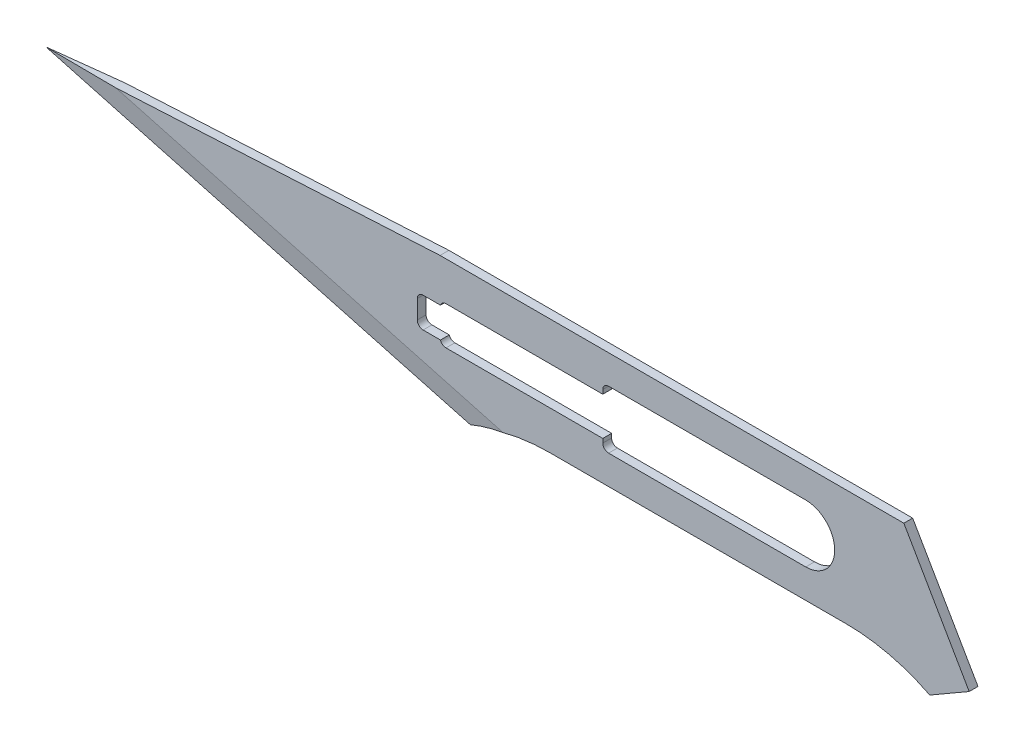
ISO-10303-21;
HEADER;
FILE_DESCRIPTION(('STEP AP214'),'2;1');
FILE_NAME('part.step','',(''),(''),'','','');
FILE_SCHEMA(('AUTOMOTIVE_DESIGN { 1 0 10303 214 1 1 1 1 }'));
ENDSEC;
DATA;
#1=APPLICATION_CONTEXT('core data for automotive mechanical design processes');
#2=APPLICATION_PROTOCOL_DEFINITION('international standard','automotive_design',2000,#1);
#3=PRODUCT_CONTEXT('',#1,'mechanical');
#4=PRODUCT('Part','Part','',(#3));
#5=PRODUCT_RELATED_PRODUCT_CATEGORY('part','',(#4));
#6=PRODUCT_DEFINITION_FORMATION('','',#4);
#7=PRODUCT_DEFINITION_CONTEXT('part definition',#1,'design');
#8=PRODUCT_DEFINITION('design','',#6,#7);
#9=PRODUCT_DEFINITION_SHAPE('','',#8);
#10=(LENGTH_UNIT() NAMED_UNIT(*) SI_UNIT(.MILLI.,.METRE.));
#11=(NAMED_UNIT(*) PLANE_ANGLE_UNIT() SI_UNIT($,.RADIAN.));
#12=(NAMED_UNIT(*) SI_UNIT($,.STERADIAN.) SOLID_ANGLE_UNIT());
#13=UNCERTAINTY_MEASURE_WITH_UNIT(LENGTH_MEASURE(1.E-05),#10,'distance_accuracy_value','');
#14=(GEOMETRIC_REPRESENTATION_CONTEXT(3) GLOBAL_UNCERTAINTY_ASSIGNED_CONTEXT((#13)) GLOBAL_UNIT_ASSIGNED_CONTEXT((#10,
#11,#12)) REPRESENTATION_CONTEXT('',''));
#15=CARTESIAN_POINT('',(0.,0.,0.));
#16=DIRECTION('',(0.,0.,1.));
#17=DIRECTION('',(1.,0.,0.));
#18=AXIS2_PLACEMENT_3D('',#15,#16,#17);
#19=CARTESIAN_POINT('',(4.72498504829211,-13.,0.19));
#20=DIRECTION('',(0.,0.,-1.));
#21=DIRECTION('',(-1.,0.,0.));
#22=AXIS2_PLACEMENT_3D('',#19,#20,#21);
#23=CYLINDRICAL_SURFACE('',#22,8.);
#24=CARTESIAN_POINT('',(4.72498504829211,-13.,-1.13003580173557));
#25=DIRECTION('',(0.0488253910720082,0.180161810286825,-0.982424451701422));
#26=DIRECTION('',(-0.256975742484254,-0.948220054141182,-0.18666064582327));
#27=AXIS2_PLACEMENT_3D('',#24,#25,#26);
#28=ELLIPSE('',#27,8.14311979526275,8.);
#29=CARTESIAN_POINT('',(2.71408046608704,-5.25685704889374,0.19));
#30=VERTEX_POINT('',#29);
#31=CARTESIAN_POINT('',(1.11660591078453,-5.86,0.));
#32=VERTEX_POINT('',#31);
#33=EDGE_CURVE('E215',#30,#32,#28,.F.);
#34=ORIENTED_EDGE('',*,*,#33,.T.);
#35=CARTESIAN_POINT('',(4.72498504829211,-13.,1.13003580173557));
#36=DIRECTION('',(0.0488253910720082,0.180161810286825,0.982424451701422));
#37=DIRECTION('',(0.256975742484254,0.948220054141182,-0.18666064582327));
#38=AXIS2_PLACEMENT_3D('',#35,#36,#37);
#39=ELLIPSE('',#38,8.14311979526275,8.);
#40=CARTESIAN_POINT('',(2.71408046608704,-5.25685704889374,-0.19));
#41=VERTEX_POINT('',#40);
#42=EDGE_CURVE('E202',#32,#41,#39,.F.);
#43=ORIENTED_EDGE('',*,*,#42,.T.);
#44=CARTESIAN_POINT('',(4.72498504829211,-13.,-0.19));
#45=DIRECTION('',(0.,0.,-1.));
#46=DIRECTION('',(1.,0.,0.));
#47=AXIS2_PLACEMENT_3D('',#44,#45,#46);
#48=CIRCLE('',#47,8.);
#49=CARTESIAN_POINT('',(4.72498504829211,-5.,-0.19));
#50=VERTEX_POINT('',#49);
#51=EDGE_CURVE('E212',#41,#50,#48,.T.);
#52=ORIENTED_EDGE('',*,*,#51,.T.);
#53=DIRECTION('',(0.,0.,-1.));
#54=VECTOR('',#53,1.);
#55=CARTESIAN_POINT('',(4.72498504829211,-5.,0.19));
#56=LINE('',#55,#54);
#57=CARTESIAN_POINT('',(4.72498504829211,-5.,0.19));
#58=VERTEX_POINT('',#57);
#59=EDGE_CURVE('E258',#58,#50,#56,.T.);
#60=ORIENTED_EDGE('',*,*,#59,.F.);
#61=CARTESIAN_POINT('',(4.72498504829211,-13.,0.19));
#62=DIRECTION('',(0.,0.,-1.));
#63=DIRECTION('',(1.,0.,0.));
#64=AXIS2_PLACEMENT_3D('',#61,#62,#63);
#65=CIRCLE('',#64,8.);
#66=EDGE_CURVE('E242',#30,#58,#65,.T.);
#67=ORIENTED_EDGE('',*,*,#66,.F.);
#68=EDGE_LOOP('',(#34,#43,#52,#60,#67));
#69=FACE_BOUND('',#68,.T.);
#70=ADVANCED_FACE('F34',(#69),#23,.F.);
#71=CARTESIAN_POINT('',(17.5082267732769,-5.,0.19));
#72=DIRECTION('',(0.,1.,0.));
#73=DIRECTION('',(0.,0.,1.));
#74=AXIS2_PLACEMENT_3D('',#71,#72,#73);
#75=PLANE('',#74);
#76=DIRECTION('',(1.,0.,0.));
#77=VECTOR('',#76,1.);
#78=CARTESIAN_POINT('',(17.5082267732769,-5.,-0.19));
#79=LINE('',#78,#77);
#80=CARTESIAN_POINT('',(17.5082267732769,-5.,-0.19));
#81=VERTEX_POINT('',#80);
#82=EDGE_CURVE('E221',#50,#81,#79,.T.);
#83=ORIENTED_EDGE('',*,*,#82,.T.);
#84=DIRECTION('',(0.,0.,-1.));
#85=VECTOR('',#84,1.);
#86=CARTESIAN_POINT('',(17.5082267732769,-5.,0.19));
#87=LINE('',#86,#85);
#88=CARTESIAN_POINT('',(17.5082267732769,-5.,0.19));
#89=VERTEX_POINT('',#88);
#90=EDGE_CURVE('E255',#89,#81,#87,.T.);
#91=ORIENTED_EDGE('',*,*,#90,.F.);
#92=DIRECTION('',(1.,0.,0.));
#93=VECTOR('',#92,1.);
#94=CARTESIAN_POINT('',(17.5082267732769,-5.,0.19));
#95=LINE('',#94,#93);
#96=EDGE_CURVE('E350',#58,#89,#95,.T.);
#97=ORIENTED_EDGE('',*,*,#96,.F.);
#98=ORIENTED_EDGE('',*,*,#59,.T.);
#99=EDGE_LOOP('',(#83,#91,#97,#98));
#100=FACE_BOUND('',#99,.T.);
#101=ADVANCED_FACE('F473',(#100),#75,.F.);
#102=CARTESIAN_POINT('',(17.5082267732769,-13.,0.19));
#103=DIRECTION('',(0.,0.,-1.));
#104=DIRECTION('',(-1.,0.,0.));
#105=AXIS2_PLACEMENT_3D('',#102,#103,#104);
#106=CYLINDRICAL_SURFACE('',#105,8.);
#107=CARTESIAN_POINT('',(17.5082267732769,-13.,-0.19));
#108=DIRECTION('',(0.,0.,-1.));
#109=DIRECTION('',(1.,0.,0.));
#110=AXIS2_PLACEMENT_3D('',#107,#108,#109);
#111=CIRCLE('',#110,8.);
#112=CARTESIAN_POINT('',(21.1166059107845,-5.86,-0.19));
#113=VERTEX_POINT('',#112);
#114=EDGE_CURVE('E224',#81,#113,#111,.T.);
#115=ORIENTED_EDGE('',*,*,#114,.T.);
#116=DIRECTION('',(0.,0.,-1.));
#117=VECTOR('',#116,1.);
#118=CARTESIAN_POINT('',(21.1166059107845,-5.86,0.19));
#119=LINE('',#118,#117);
#120=CARTESIAN_POINT('',(21.1166059107845,-5.86,0.19));
#121=VERTEX_POINT('',#120);
#122=EDGE_CURVE('E252',#121,#113,#119,.T.);
#123=ORIENTED_EDGE('',*,*,#122,.F.);
#124=CARTESIAN_POINT('',(17.5082267732769,-13.,0.19));
#125=DIRECTION('',(0.,0.,-1.));
#126=DIRECTION('',(1.,0.,0.));
#127=AXIS2_PLACEMENT_3D('',#124,#125,#126);
#128=CIRCLE('',#127,8.);
#129=EDGE_CURVE('E352',#89,#121,#128,.T.);
#130=ORIENTED_EDGE('',*,*,#129,.F.);
#131=ORIENTED_EDGE('',*,*,#90,.T.);
#132=EDGE_LOOP('',(#115,#123,#130,#131));
#133=FACE_BOUND('',#132,.T.);
#134=ADVANCED_FACE('F478',(#133),#106,.F.);
#135=CARTESIAN_POINT('',(22.8166059107845,-4.87850454237764,0.19));
#136=DIRECTION('',(-0.499999999999998,0.86602540378444,0.));
#137=DIRECTION('',(-0.86602540378444,-0.499999999999998,0.));
#138=AXIS2_PLACEMENT_3D('',#135,#136,#137);
#139=PLANE('',#138);
#140=DIRECTION('',(0.86602540378444,0.499999999999998,0.));
#141=VECTOR('',#140,1.);
#142=CARTESIAN_POINT('',(22.8166059107845,-4.87850454237764,-0.19));
#143=LINE('',#142,#141);
#144=CARTESIAN_POINT('',(22.8166059107845,-4.87850454237764,-0.19));
#145=VERTEX_POINT('',#144);
#146=EDGE_CURVE('E234',#113,#145,#143,.T.);
#147=ORIENTED_EDGE('',*,*,#146,.T.);
#148=DIRECTION('',(0.,0.,-1.));
#149=VECTOR('',#148,1.);
#150=CARTESIAN_POINT('',(22.8166059107845,-4.87850454237764,0.19));
#151=LINE('',#150,#149);
#152=CARTESIAN_POINT('',(22.8166059107845,-4.87850454237764,0.19));
#153=VERTEX_POINT('',#152);
#154=EDGE_CURVE('E249',#153,#145,#151,.T.);
#155=ORIENTED_EDGE('',*,*,#154,.F.);
#156=DIRECTION('',(0.86602540378444,0.499999999999998,0.));
#157=VECTOR('',#156,1.);
#158=CARTESIAN_POINT('',(22.8166059107845,-4.87850454237764,0.19));
#159=LINE('',#158,#157);
#160=EDGE_CURVE('E354',#121,#153,#159,.T.);
#161=ORIENTED_EDGE('',*,*,#160,.F.);
#162=ORIENTED_EDGE('',*,*,#122,.T.);
#163=EDGE_LOOP('',(#147,#155,#161,#162));
#164=FACE_BOUND('',#163,.T.);
#165=ADVANCED_FACE('F509',(#164),#139,.F.);
#166=CARTESIAN_POINT('',(20.,0.,0.19));
#167=DIRECTION('',(-0.86602540378444,-0.499999999999998,0.));
#168=DIRECTION('',(0.499999999999998,-0.86602540378444,0.));
#169=AXIS2_PLACEMENT_3D('',#166,#167,#168);
#170=PLANE('',#169);
#171=DIRECTION('',(-0.499999999999998,0.86602540378444,0.));
#172=VECTOR('',#171,1.);
#173=CARTESIAN_POINT('',(20.,0.,-0.19));
#174=LINE('',#173,#172);
#175=CARTESIAN_POINT('',(20.,0.,-0.19));
#176=VERTEX_POINT('',#175);
#177=EDGE_CURVE('E236',#145,#176,#174,.T.);
#178=ORIENTED_EDGE('',*,*,#177,.T.);
#179=DIRECTION('',(0.,0.,-1.));
#180=VECTOR('',#179,1.);
#181=CARTESIAN_POINT('',(20.,0.,0.19));
#182=LINE('',#181,#180);
#183=CARTESIAN_POINT('',(20.,0.,0.19));
#184=VERTEX_POINT('',#183);
#185=EDGE_CURVE('E246',#184,#176,#182,.T.);
#186=ORIENTED_EDGE('',*,*,#185,.F.);
#187=DIRECTION('',(-0.499999999999998,0.86602540378444,0.));
#188=VECTOR('',#187,1.);
#189=CARTESIAN_POINT('',(20.,0.,0.19));
#190=LINE('',#189,#188);
#191=EDGE_CURVE('E356',#153,#184,#190,.T.);
#192=ORIENTED_EDGE('',*,*,#191,.F.);
#193=ORIENTED_EDGE('',*,*,#154,.T.);
#194=EDGE_LOOP('',(#178,#186,#192,#193));
#195=FACE_BOUND('',#194,.T.);
#196=ADVANCED_FACE('F505',(#195),#170,.F.);
#197=CARTESIAN_POINT('',(0.,0.,0.19));
#198=DIRECTION('',(0.,-1.,0.));
#199=DIRECTION('',(0.,0.,-1.));
#200=AXIS2_PLACEMENT_3D('',#197,#198,#199);
#201=PLANE('',#200);
#202=DIRECTION('',(-1.,0.,0.));
#203=VECTOR('',#202,1.);
#204=CARTESIAN_POINT('',(0.,0.,-0.19));
#205=LINE('',#204,#203);
#206=CARTESIAN_POINT('',(0.,0.,-0.19));
#207=VERTEX_POINT('',#206);
#208=EDGE_CURVE('E238',#176,#207,#205,.T.);
#209=ORIENTED_EDGE('',*,*,#208,.T.);
#210=DIRECTION('',(0.,0.,-1.));
#211=VECTOR('',#210,1.);
#212=CARTESIAN_POINT('',(0.,0.,0.19));
#213=LINE('',#212,#211);
#214=CARTESIAN_POINT('',(0.,0.,0.19));
#215=VERTEX_POINT('',#214);
#216=EDGE_CURVE('E243',#215,#207,#213,.T.);
#217=ORIENTED_EDGE('',*,*,#216,.F.);
#218=DIRECTION('',(-1.,0.,0.));
#219=VECTOR('',#218,1.);
#220=CARTESIAN_POINT('',(0.,0.,0.19));
#221=LINE('',#220,#219);
#222=EDGE_CURVE('E357',#184,#215,#221,.T.);
#223=ORIENTED_EDGE('',*,*,#222,.F.);
#224=ORIENTED_EDGE('',*,*,#185,.T.);
#225=EDGE_LOOP('',(#209,#217,#223,#224));
#226=FACE_BOUND('',#225,.T.);
#227=ADVANCED_FACE('F502',(#226),#201,.F.);
#228=CARTESIAN_POINT('',(-17.1833940892155,-0.900543524761129,0.19));
#229=DIRECTION('',(0.0523359562429444,-0.998629534754574,0.));
#230=DIRECTION('',(0.998629534754574,0.0523359562429444,0.));
#231=AXIS2_PLACEMENT_3D('',#228,#229,#230);
#232=PLANE('',#231);
#233=DIRECTION('',(-0.998629534754574,-0.0523359562429444,0.));
#234=VECTOR('',#233,1.);
#235=CARTESIAN_POINT('',(-17.1833940892155,-0.900543524761129,-0.19));
#236=LINE('',#235,#234);
#237=CARTESIAN_POINT('',(-13.9798693463588,-0.732653907109727,-0.19));
#238=VERTEX_POINT('',#237);
#239=EDGE_CURVE('E240',#207,#238,#236,.T.);
#240=ORIENTED_EDGE('',*,*,#239,.T.);
#241=DIRECTION('',(-0.996882532508418,-0.0522443997348209,0.0591247754833006));
#242=VECTOR('',#241,1.);
#243=CARTESIAN_POINT('',(-17.1945927758399,-0.901130423057999,0.000664190424430448));
#244=LINE('',#243,#242);
#245=CARTESIAN_POINT('',(-17.1833940892154,-0.900543524761139,0.));
#246=VERTEX_POINT('',#245);
#247=EDGE_CURVE('E49',#238,#246,#244,.T.);
#248=ORIENTED_EDGE('',*,*,#247,.T.);
#249=DIRECTION('',(0.996882532508418,0.0522443997348209,0.0591247754833006));
#250=VECTOR('',#249,1.);
#251=CARTESIAN_POINT('',(-17.1721954025911,-0.899956626464258,0.000664190424430855));
#252=LINE('',#251,#250);
#253=CARTESIAN_POINT('',(-13.9798693463588,-0.73265390710972,0.19));
#254=VERTEX_POINT('',#253);
#255=EDGE_CURVE('E216',#246,#254,#252,.T.);
#256=ORIENTED_EDGE('',*,*,#255,.T.);
#257=DIRECTION('',(-0.998629534754574,-0.0523359562429444,0.));
#258=VECTOR('',#257,1.);
#259=CARTESIAN_POINT('',(-17.1833940892155,-0.900543524761129,0.19));
#260=LINE('',#259,#258);
#261=EDGE_CURVE('E230',#215,#254,#260,.T.);
#262=ORIENTED_EDGE('',*,*,#261,.F.);
#263=ORIENTED_EDGE('',*,*,#216,.T.);
#264=EDGE_LOOP('',(#240,#248,#256,#262,#263));
#265=FACE_BOUND('',#264,.T.);
#266=ADVANCED_FACE('F366',(#265),#232,.F.);
#267=CARTESIAN_POINT('',(17.5082267732769,-13.,0.19));
#268=DIRECTION('',(0.,0.,1.));
#269=DIRECTION('',(1.,0.,0.));
#270=AXIS2_PLACEMENT_3D('',#267,#268,#269);
#271=PLANE('',#270);
#272=DIRECTION('',(-0.965183686642772,0.261573031940733,0.));
#273=VECTOR('',#272,1.);
#274=CARTESIAN_POINT('',(18.4508851188766,-9.52166566828425,0.19));
#275=LINE('',#274,#273);
#276=EDGE_CURVE('E11',#30,#254,#275,.T.);
#277=ORIENTED_EDGE('',*,*,#276,.F.);
#278=ORIENTED_EDGE('',*,*,#66,.T.);
#279=ORIENTED_EDGE('',*,*,#96,.T.);
#280=ORIENTED_EDGE('',*,*,#129,.T.);
#281=ORIENTED_EDGE('',*,*,#160,.T.);
#282=ORIENTED_EDGE('',*,*,#191,.T.);
#283=ORIENTED_EDGE('',*,*,#222,.T.);
#284=ORIENTED_EDGE('',*,*,#261,.T.);
#285=EDGE_LOOP('',(#277,#278,#279,#280,#281,#282,#283,#284));
#286=FACE_BOUND('',#285,.T.);
#287=DIRECTION('',(0.,-1.,0.));
#288=VECTOR('',#287,1.);
#289=CARTESIAN_POINT('',(-0.983394089215472,-1.85,0.19));
#290=LINE('',#289,#288);
#291=CARTESIAN_POINT('',(-0.983394089215472,-2.1,0.19));
#292=VERTEX_POINT('',#291);
#293=CARTESIAN_POINT('',(-0.983394089215472,-2.9,0.19));
#294=VERTEX_POINT('',#293);
#295=EDGE_CURVE('E326',#292,#294,#290,.T.);
#296=ORIENTED_EDGE('',*,*,#295,.F.);
#297=CARTESIAN_POINT('',(-0.733394089215472,-2.1,0.19));
#298=DIRECTION('',(0.,0.,1.));
#299=DIRECTION('',(1.,0.,0.));
#300=AXIS2_PLACEMENT_3D('',#297,#298,#299);
#301=CIRCLE('',#300,0.25);
#302=CARTESIAN_POINT('',(-0.733394089215472,-1.85,0.19));
#303=VERTEX_POINT('',#302);
#304=EDGE_CURVE('E304',#292,#303,#301,.F.);
#305=ORIENTED_EDGE('',*,*,#304,.T.);
#306=DIRECTION('',(-1.,0.,0.));
#307=VECTOR('',#306,1.);
#308=CARTESIAN_POINT('',(-0.983394089215472,-1.85,0.19));
#309=LINE('',#308,#307);
#310=CARTESIAN_POINT('',(0.0166059107845297,-1.85,0.19));
#311=VERTEX_POINT('',#310);
#312=EDGE_CURVE('E321',#311,#303,#309,.T.);
#313=ORIENTED_EDGE('',*,*,#312,.F.);
#314=CARTESIAN_POINT('',(0.255090711138766,-1.925,0.19));
#315=DIRECTION('',(0.,0.,1.));
#316=DIRECTION('',(1.,0.,0.));
#317=AXIS2_PLACEMENT_3D('',#314,#315,#316);
#318=CIRCLE('',#317,0.25);
#319=CARTESIAN_POINT('',(0.255090711138766,-1.675,0.19));
#320=VERTEX_POINT('',#319);
#321=EDGE_CURVE('E296',#311,#320,#318,.F.);
#322=ORIENTED_EDGE('',*,*,#321,.T.);
#323=DIRECTION('',(-1.,0.,0.));
#324=VECTOR('',#323,1.);
#325=CARTESIAN_POINT('',(0.0166059107845297,-1.675,0.19));
#326=LINE('',#325,#324);
#327=CARTESIAN_POINT('',(7.01660591078453,-1.675,0.19));
#328=VERTEX_POINT('',#327);
#329=EDGE_CURVE('E329',#328,#320,#326,.T.);
#330=ORIENTED_EDGE('',*,*,#329,.F.);
#331=DIRECTION('',(0.,-1.,0.));
#332=VECTOR('',#331,1.);
#333=CARTESIAN_POINT('',(7.01660591078453,-1.675,0.19));
#334=LINE('',#333,#332);
#335=CARTESIAN_POINT('',(7.01660591078453,-1.5,0.19));
#336=VERTEX_POINT('',#335);
#337=EDGE_CURVE('E332',#336,#328,#334,.T.);
#338=ORIENTED_EDGE('',*,*,#337,.F.);
#339=CARTESIAN_POINT('',(7.26660591078453,-1.5,0.19));
#340=DIRECTION('',(0.,0.,1.));
#341=DIRECTION('',(1.,0.,0.));
#342=AXIS2_PLACEMENT_3D('',#339,#340,#341);
#343=CIRCLE('',#342,0.25);
#344=CARTESIAN_POINT('',(7.26660591078453,-1.25,0.19));
#345=VERTEX_POINT('',#344);
#346=EDGE_CURVE('E288',#336,#345,#343,.F.);
#347=ORIENTED_EDGE('',*,*,#346,.T.);
#348=DIRECTION('',(-1.,0.,0.));
#349=VECTOR('',#348,1.);
#350=CARTESIAN_POINT('',(7.01660591078453,-1.25,0.19));
#351=LINE('',#350,#349);
#352=CARTESIAN_POINT('',(15.7666059107845,-1.25,0.19));
#353=VERTEX_POINT('',#352);
#354=EDGE_CURVE('E406',#353,#345,#351,.T.);
#355=ORIENTED_EDGE('',*,*,#354,.F.);
#356=CARTESIAN_POINT('',(15.7666059107845,-2.5,0.19));
#357=DIRECTION('',(0.,0.,1.));
#358=DIRECTION('',(-1.,0.,0.));
#359=AXIS2_PLACEMENT_3D('',#356,#357,#358);
#360=CIRCLE('',#359,1.25);
#361=CARTESIAN_POINT('',(15.7666059107845,-3.75,0.19));
#362=VERTEX_POINT('',#361);
#363=EDGE_CURVE('E403',#362,#353,#360,.T.);
#364=ORIENTED_EDGE('',*,*,#363,.F.);
#365=DIRECTION('',(1.,0.,0.));
#366=VECTOR('',#365,1.);
#367=CARTESIAN_POINT('',(7.01660591078453,-3.75,0.19));
#368=LINE('',#367,#366);
#369=CARTESIAN_POINT('',(7.26660591078453,-3.75,0.19));
#370=VERTEX_POINT('',#369);
#371=EDGE_CURVE('E401',#370,#362,#368,.T.);
#372=ORIENTED_EDGE('',*,*,#371,.F.);
#373=CARTESIAN_POINT('',(7.26660591078453,-3.5,0.19));
#374=DIRECTION('',(0.,0.,1.));
#375=DIRECTION('',(1.,0.,0.));
#376=AXIS2_PLACEMENT_3D('',#373,#374,#375);
#377=CIRCLE('',#376,0.25);
#378=CARTESIAN_POINT('',(7.01660591078453,-3.5,0.19));
#379=VERTEX_POINT('',#378);
#380=EDGE_CURVE('E284',#370,#379,#377,.F.);
#381=ORIENTED_EDGE('',*,*,#380,.T.);
#382=DIRECTION('',(0.,-1.,0.));
#383=VECTOR('',#382,1.);
#384=CARTESIAN_POINT('',(7.01660591078453,-3.325,0.19));
#385=LINE('',#384,#383);
#386=CARTESIAN_POINT('',(7.01660591078453,-3.325,0.19));
#387=VERTEX_POINT('',#386);
#388=EDGE_CURVE('E398',#387,#379,#385,.T.);
#389=ORIENTED_EDGE('',*,*,#388,.F.);
#390=DIRECTION('',(1.,0.,0.));
#391=VECTOR('',#390,1.);
#392=CARTESIAN_POINT('',(0.0166059107845297,-3.325,0.19));
#393=LINE('',#392,#391);
#394=CARTESIAN_POINT('',(0.255090711138766,-3.325,0.19));
#395=VERTEX_POINT('',#394);
#396=EDGE_CURVE('E396',#395,#387,#393,.T.);
#397=ORIENTED_EDGE('',*,*,#396,.F.);
#398=CARTESIAN_POINT('',(0.255090711138766,-3.075,0.19));
#399=DIRECTION('',(0.,0.,1.));
#400=DIRECTION('',(1.,0.,0.));
#401=AXIS2_PLACEMENT_3D('',#398,#399,#400);
#402=CIRCLE('',#401,0.25);
#403=CARTESIAN_POINT('',(0.0166059107845297,-3.15,0.19));
#404=VERTEX_POINT('',#403);
#405=EDGE_CURVE('E292',#395,#404,#402,.F.);
#406=ORIENTED_EDGE('',*,*,#405,.T.);
#407=DIRECTION('',(1.,0.,0.));
#408=VECTOR('',#407,1.);
#409=CARTESIAN_POINT('',(-0.983394089215472,-3.15,0.19));
#410=LINE('',#409,#408);
#411=CARTESIAN_POINT('',(-0.733394089215472,-3.15,0.19));
#412=VERTEX_POINT('',#411);
#413=EDGE_CURVE('E393',#412,#404,#410,.T.);
#414=ORIENTED_EDGE('',*,*,#413,.F.);
#415=CARTESIAN_POINT('',(-0.733394089215472,-2.9,0.19));
#416=DIRECTION('',(0.,0.,1.));
#417=DIRECTION('',(1.,0.,0.));
#418=AXIS2_PLACEMENT_3D('',#415,#416,#417);
#419=CIRCLE('',#418,0.25);
#420=EDGE_CURVE('E300',#412,#294,#419,.F.);
#421=ORIENTED_EDGE('',*,*,#420,.T.);
#422=EDGE_LOOP('',(#296,#305,#313,#322,#330,#338,#347,#355,#364,#372,#381,#389,#397,#406,#414,#421));
#423=FACE_BOUND('',#422,.T.);
#424=ADVANCED_FACE('F325',(#286,#423),#271,.T.);
#425=CARTESIAN_POINT('',(17.5082267732769,-13.,-0.19));
#426=DIRECTION('',(0.,0.,1.));
#427=DIRECTION('',(1.,0.,0.));
#428=AXIS2_PLACEMENT_3D('',#425,#426,#427);
#429=PLANE('',#428);
#430=DIRECTION('',(-1.,0.,0.));
#431=VECTOR('',#430,1.);
#432=CARTESIAN_POINT('',(-0.983394089215472,-1.85,-0.19));
#433=LINE('',#432,#431);
#434=CARTESIAN_POINT('',(0.0166059107845297,-1.85,-0.19));
#435=VERTEX_POINT('',#434);
#436=CARTESIAN_POINT('',(-0.733394089215472,-1.85,-0.19));
#437=VERTEX_POINT('',#436);
#438=EDGE_CURVE('E312',#435,#437,#433,.T.);
#439=ORIENTED_EDGE('',*,*,#438,.T.);
#440=CARTESIAN_POINT('',(-0.733394089215472,-2.1,-0.19));
#441=DIRECTION('',(0.,0.,1.));
#442=DIRECTION('',(1.,0.,0.));
#443=AXIS2_PLACEMENT_3D('',#440,#441,#442);
#444=CIRCLE('',#443,0.25);
#445=CARTESIAN_POINT('',(-0.983394089215472,-2.1,-0.19));
#446=VERTEX_POINT('',#445);
#447=EDGE_CURVE('E208',#437,#446,#444,.T.);
#448=ORIENTED_EDGE('',*,*,#447,.T.);
#449=DIRECTION('',(0.,-1.,0.));
#450=VECTOR('',#449,1.);
#451=CARTESIAN_POINT('',(-0.983394089215472,-1.85,-0.19));
#452=LINE('',#451,#450);
#453=CARTESIAN_POINT('',(-0.983394089215472,-2.9,-0.19));
#454=VERTEX_POINT('',#453);
#455=EDGE_CURVE('E310',#446,#454,#452,.T.);
#456=ORIENTED_EDGE('',*,*,#455,.T.);
#457=CARTESIAN_POINT('',(-0.733394089215472,-2.9,-0.19));
#458=DIRECTION('',(0.,0.,1.));
#459=DIRECTION('',(1.,0.,0.));
#460=AXIS2_PLACEMENT_3D('',#457,#458,#459);
#461=CIRCLE('',#460,0.25);
#462=CARTESIAN_POINT('',(-0.733394089215472,-3.15,-0.19));
#463=VERTEX_POINT('',#462);
#464=EDGE_CURVE('E302',#454,#463,#461,.T.);
#465=ORIENTED_EDGE('',*,*,#464,.T.);
#466=DIRECTION('',(1.,0.,0.));
#467=VECTOR('',#466,1.);
#468=CARTESIAN_POINT('',(-0.983394089215472,-3.15,-0.19));
#469=LINE('',#468,#467);
#470=CARTESIAN_POINT('',(0.0166059107845271,-3.15,-0.19));
#471=VERTEX_POINT('',#470);
#472=EDGE_CURVE('E320',#463,#471,#469,.T.);
#473=ORIENTED_EDGE('',*,*,#472,.T.);
#474=CARTESIAN_POINT('',(0.255090711138766,-3.075,-0.19));
#475=DIRECTION('',(0.,0.,1.));
#476=DIRECTION('',(1.,0.,0.));
#477=AXIS2_PLACEMENT_3D('',#474,#475,#476);
#478=CIRCLE('',#477,0.25);
#479=CARTESIAN_POINT('',(0.255090711138766,-3.325,-0.19));
#480=VERTEX_POINT('',#479);
#481=EDGE_CURVE('E294',#471,#480,#478,.T.);
#482=ORIENTED_EDGE('',*,*,#481,.T.);
#483=DIRECTION('',(1.,0.,0.));
#484=VECTOR('',#483,1.);
#485=CARTESIAN_POINT('',(0.0166059107845297,-3.325,-0.19));
#486=LINE('',#485,#484);
#487=CARTESIAN_POINT('',(7.01660591078453,-3.325,-0.19));
#488=VERTEX_POINT('',#487);
#489=EDGE_CURVE('E373',#480,#488,#486,.T.);
#490=ORIENTED_EDGE('',*,*,#489,.T.);
#491=DIRECTION('',(0.,-1.,0.));
#492=VECTOR('',#491,1.);
#493=CARTESIAN_POINT('',(7.01660591078453,-3.325,-0.19));
#494=LINE('',#493,#492);
#495=CARTESIAN_POINT('',(7.01660591078453,-3.5,-0.19));
#496=VERTEX_POINT('',#495);
#497=EDGE_CURVE('E375',#488,#496,#494,.T.);
#498=ORIENTED_EDGE('',*,*,#497,.T.);
#499=CARTESIAN_POINT('',(7.26660591078453,-3.5,-0.19));
#500=DIRECTION('',(0.,0.,1.));
#501=DIRECTION('',(1.,0.,0.));
#502=AXIS2_PLACEMENT_3D('',#499,#500,#501);
#503=CIRCLE('',#502,0.25);
#504=CARTESIAN_POINT('',(7.26660591078453,-3.75,-0.19));
#505=VERTEX_POINT('',#504);
#506=EDGE_CURVE('E286',#496,#505,#503,.T.);
#507=ORIENTED_EDGE('',*,*,#506,.T.);
#508=DIRECTION('',(1.,0.,0.));
#509=VECTOR('',#508,1.);
#510=CARTESIAN_POINT('',(7.01660591078453,-3.75,-0.19));
#511=LINE('',#510,#509);
#512=CARTESIAN_POINT('',(15.7666059107845,-3.75,-0.19));
#513=VERTEX_POINT('',#512);
#514=EDGE_CURVE('E378',#505,#513,#511,.T.);
#515=ORIENTED_EDGE('',*,*,#514,.T.);
#516=CARTESIAN_POINT('',(15.7666059107845,-2.5,-0.19));
#517=DIRECTION('',(0.,0.,1.));
#518=DIRECTION('',(-1.,0.,0.));
#519=AXIS2_PLACEMENT_3D('',#516,#517,#518);
#520=CIRCLE('',#519,1.25);
#521=CARTESIAN_POINT('',(15.7666059107845,-1.25,-0.19));
#522=VERTEX_POINT('',#521);
#523=EDGE_CURVE('E380',#513,#522,#520,.T.);
#524=ORIENTED_EDGE('',*,*,#523,.T.);
#525=DIRECTION('',(-1.,0.,0.));
#526=VECTOR('',#525,1.);
#527=CARTESIAN_POINT('',(7.01660591078453,-1.25,-0.19));
#528=LINE('',#527,#526);
#529=CARTESIAN_POINT('',(7.26660591078453,-1.25,-0.19));
#530=VERTEX_POINT('',#529);
#531=EDGE_CURVE('E383',#522,#530,#528,.T.);
#532=ORIENTED_EDGE('',*,*,#531,.T.);
#533=CARTESIAN_POINT('',(7.26660591078453,-1.5,-0.19));
#534=DIRECTION('',(0.,0.,1.));
#535=DIRECTION('',(1.,0.,0.));
#536=AXIS2_PLACEMENT_3D('',#533,#534,#535);
#537=CIRCLE('',#536,0.25);
#538=CARTESIAN_POINT('',(7.01660591078453,-1.5,-0.19));
#539=VERTEX_POINT('',#538);
#540=EDGE_CURVE('E290',#530,#539,#537,.T.);
#541=ORIENTED_EDGE('',*,*,#540,.T.);
#542=DIRECTION('',(0.,-1.,0.));
#543=VECTOR('',#542,1.);
#544=CARTESIAN_POINT('',(7.01660591078453,-1.675,-0.19));
#545=LINE('',#544,#543);
#546=CARTESIAN_POINT('',(7.01660591078453,-1.675,-0.19));
#547=VERTEX_POINT('',#546);
#548=EDGE_CURVE('E386',#539,#547,#545,.T.);
#549=ORIENTED_EDGE('',*,*,#548,.T.);
#550=DIRECTION('',(-1.,0.,0.));
#551=VECTOR('',#550,1.);
#552=CARTESIAN_POINT('',(0.0166059107845297,-1.675,-0.19));
#553=LINE('',#552,#551);
#554=CARTESIAN_POINT('',(0.255090711138766,-1.675,-0.19));
#555=VERTEX_POINT('',#554);
#556=EDGE_CURVE('E388',#547,#555,#553,.T.);
#557=ORIENTED_EDGE('',*,*,#556,.T.);
#558=CARTESIAN_POINT('',(0.255090711138766,-1.925,-0.19));
#559=DIRECTION('',(0.,0.,1.));
#560=DIRECTION('',(1.,0.,0.));
#561=AXIS2_PLACEMENT_3D('',#558,#559,#560);
#562=CIRCLE('',#561,0.25);
#563=EDGE_CURVE('E298',#555,#435,#562,.T.);
#564=ORIENTED_EDGE('',*,*,#563,.T.);
#565=EDGE_LOOP('',(#439,#448,#456,#465,#473,#482,#490,#498,#507,#515,#524,#532,#541,#549,#557,#564));
#566=FACE_BOUND('',#565,.T.);
#567=ORIENTED_EDGE('',*,*,#51,.F.);
#568=DIRECTION('',(-0.965183686642772,0.261573031940733,0.));
#569=VECTOR('',#568,1.);
#570=CARTESIAN_POINT('',(18.4508851188766,-9.52166566828425,-0.19));
#571=LINE('',#570,#569);
#572=EDGE_CURVE('E42',#41,#238,#571,.T.);
#573=ORIENTED_EDGE('',*,*,#572,.T.);
#574=ORIENTED_EDGE('',*,*,#239,.F.);
#575=ORIENTED_EDGE('',*,*,#208,.F.);
#576=ORIENTED_EDGE('',*,*,#177,.F.);
#577=ORIENTED_EDGE('',*,*,#146,.F.);
#578=ORIENTED_EDGE('',*,*,#114,.F.);
#579=ORIENTED_EDGE('',*,*,#82,.F.);
#580=EDGE_LOOP('',(#567,#573,#574,#575,#576,#577,#578,#579));
#581=FACE_BOUND('',#580,.T.);
#582=ADVANCED_FACE('F219',(#566,#581),#429,.F.);
#583=CARTESIAN_POINT('',(-0.983394089215472,-1.85,-0.19));
#584=DIRECTION('',(-1.,0.,0.));
#585=DIRECTION('',(0.,0.,1.));
#586=AXIS2_PLACEMENT_3D('',#583,#584,#585);
#587=PLANE('',#586);
#588=ORIENTED_EDGE('',*,*,#295,.T.);
#589=DIRECTION('',(0.,0.,1.));
#590=VECTOR('',#589,1.);
#591=CARTESIAN_POINT('',(-0.983394089215472,-2.9,-0.19));
#592=LINE('',#591,#590);
#593=EDGE_CURVE('E281',#294,#454,#592,.F.);
#594=ORIENTED_EDGE('',*,*,#593,.T.);
#595=ORIENTED_EDGE('',*,*,#455,.F.);
#596=DIRECTION('',(0.,0.,1.));
#597=VECTOR('',#596,1.);
#598=CARTESIAN_POINT('',(-0.983394089215472,-2.1,0.19));
#599=LINE('',#598,#597);
#600=EDGE_CURVE('E278',#446,#292,#599,.T.);
#601=ORIENTED_EDGE('',*,*,#600,.T.);
#602=EDGE_LOOP('',(#588,#594,#595,#601));
#603=FACE_BOUND('',#602,.T.);
#604=ADVANCED_FACE('F317',(#603),#587,.F.);
#605=CARTESIAN_POINT('',(-0.983394089215472,-1.85,-0.19));
#606=DIRECTION('',(0.,1.,0.));
#607=DIRECTION('',(0.,0.,1.));
#608=AXIS2_PLACEMENT_3D('',#605,#606,#607);
#609=PLANE('',#608);
#610=ORIENTED_EDGE('',*,*,#312,.T.);
#611=DIRECTION('',(0.,0.,1.));
#612=VECTOR('',#611,1.);
#613=CARTESIAN_POINT('',(-0.733394089215472,-1.85,-0.19));
#614=LINE('',#613,#612);
#615=EDGE_CURVE('E57',#303,#437,#614,.F.);
#616=ORIENTED_EDGE('',*,*,#615,.T.);
#617=ORIENTED_EDGE('',*,*,#438,.F.);
#618=DIRECTION('',(0.,0.,1.));
#619=VECTOR('',#618,1.);
#620=CARTESIAN_POINT('',(0.0166059107845297,-1.85,-0.19));
#621=LINE('',#620,#619);
#622=EDGE_CURVE('E222',#435,#311,#621,.T.);
#623=ORIENTED_EDGE('',*,*,#622,.T.);
#624=EDGE_LOOP('',(#610,#616,#617,#623));
#625=FACE_BOUND('',#624,.T.);
#626=ADVANCED_FACE('F327',(#625),#609,.F.);
#627=CARTESIAN_POINT('',(0.0166059107845297,-1.675,-0.19));
#628=DIRECTION('',(0.,1.,0.));
#629=DIRECTION('',(-1.,0.,0.));
#630=AXIS2_PLACEMENT_3D('',#627,#628,#629);
#631=PLANE('',#630);
#632=ORIENTED_EDGE('',*,*,#329,.T.);
#633=DIRECTION('',(0.,0.,-1.));
#634=VECTOR('',#633,1.);
#635=CARTESIAN_POINT('',(0.255090711138766,-1.675,-0.19));
#636=LINE('',#635,#634);
#637=EDGE_CURVE('E273',#320,#555,#636,.T.);
#638=ORIENTED_EDGE('',*,*,#637,.T.);
#639=ORIENTED_EDGE('',*,*,#556,.F.);
#640=DIRECTION('',(0.,0.,1.));
#641=VECTOR('',#640,1.);
#642=CARTESIAN_POINT('',(7.01660591078453,-1.675,-0.19));
#643=LINE('',#642,#641);
#644=EDGE_CURVE('E227',#547,#328,#643,.T.);
#645=ORIENTED_EDGE('',*,*,#644,.T.);
#646=EDGE_LOOP('',(#632,#638,#639,#645));
#647=FACE_BOUND('',#646,.T.);
#648=ADVANCED_FACE('F417',(#647),#631,.F.);
#649=CARTESIAN_POINT('',(7.01660591078453,-1.675,-0.19));
#650=DIRECTION('',(-1.,0.,0.));
#651=DIRECTION('',(0.,0.,1.));
#652=AXIS2_PLACEMENT_3D('',#649,#650,#651);
#653=PLANE('',#652);
#654=ORIENTED_EDGE('',*,*,#548,.F.);
#655=DIRECTION('',(0.,0.,1.));
#656=VECTOR('',#655,1.);
#657=CARTESIAN_POINT('',(7.01660591078453,-1.5,0.19));
#658=LINE('',#657,#656);
#659=EDGE_CURVE('E265',#539,#336,#658,.T.);
#660=ORIENTED_EDGE('',*,*,#659,.T.);
#661=ORIENTED_EDGE('',*,*,#337,.T.);
#662=ORIENTED_EDGE('',*,*,#644,.F.);
#663=EDGE_LOOP('',(#654,#660,#661,#662));
#664=FACE_BOUND('',#663,.T.);
#665=ADVANCED_FACE('F412',(#664),#653,.F.);
#666=CARTESIAN_POINT('',(7.01660591078453,-1.25,-0.19));
#667=DIRECTION('',(0.,1.,0.));
#668=DIRECTION('',(0.,0.,1.));
#669=AXIS2_PLACEMENT_3D('',#666,#667,#668);
#670=PLANE('',#669);
#671=ORIENTED_EDGE('',*,*,#354,.T.);
#672=DIRECTION('',(0.,0.,1.));
#673=VECTOR('',#672,1.);
#674=CARTESIAN_POINT('',(7.26660591078453,-1.25,-0.19));
#675=LINE('',#674,#673);
#676=EDGE_CURVE('E268',#345,#530,#675,.F.);
#677=ORIENTED_EDGE('',*,*,#676,.T.);
#678=ORIENTED_EDGE('',*,*,#531,.F.);
#679=DIRECTION('',(0.,0.,1.));
#680=VECTOR('',#679,1.);
#681=CARTESIAN_POINT('',(15.7666059107845,-1.25,-0.19));
#682=LINE('',#681,#680);
#683=EDGE_CURVE('E338',#522,#353,#682,.T.);
#684=ORIENTED_EDGE('',*,*,#683,.T.);
#685=EDGE_LOOP('',(#671,#677,#678,#684));
#686=FACE_BOUND('',#685,.T.);
#687=ADVANCED_FACE('F429',(#686),#670,.F.);
#688=CARTESIAN_POINT('',(15.7666059107845,-2.5,-0.19));
#689=DIRECTION('',(0.,0.,1.));
#690=DIRECTION('',(1.,0.,0.));
#691=AXIS2_PLACEMENT_3D('',#688,#689,#690);
#692=CYLINDRICAL_SURFACE('',#691,1.25);
#693=ORIENTED_EDGE('',*,*,#363,.T.);
#694=ORIENTED_EDGE('',*,*,#683,.F.);
#695=ORIENTED_EDGE('',*,*,#523,.F.);
#696=DIRECTION('',(0.,0.,1.));
#697=VECTOR('',#696,1.);
#698=CARTESIAN_POINT('',(15.7666059107845,-3.75,-0.19));
#699=LINE('',#698,#697);
#700=EDGE_CURVE('E340',#513,#362,#699,.T.);
#701=ORIENTED_EDGE('',*,*,#700,.T.);
#702=EDGE_LOOP('',(#693,#694,#695,#701));
#703=FACE_BOUND('',#702,.T.);
#704=ADVANCED_FACE('F433',(#703),#692,.F.);
#705=CARTESIAN_POINT('',(7.01660591078453,-3.75,-0.19));
#706=DIRECTION('',(0.,-1.,0.));
#707=DIRECTION('',(1.,0.,0.));
#708=AXIS2_PLACEMENT_3D('',#705,#706,#707);
#709=PLANE('',#708);
#710=ORIENTED_EDGE('',*,*,#514,.F.);
#711=DIRECTION('',(0.,0.,1.));
#712=VECTOR('',#711,1.);
#713=CARTESIAN_POINT('',(7.26660591078453,-3.75,0.19));
#714=LINE('',#713,#712);
#715=EDGE_CURVE('E260',#505,#370,#714,.T.);
#716=ORIENTED_EDGE('',*,*,#715,.T.);
#717=ORIENTED_EDGE('',*,*,#371,.T.);
#718=ORIENTED_EDGE('',*,*,#700,.F.);
#719=EDGE_LOOP('',(#710,#716,#717,#718));
#720=FACE_BOUND('',#719,.T.);
#721=ADVANCED_FACE('F439',(#720),#709,.F.);
#722=CARTESIAN_POINT('',(7.01660591078453,-3.325,-0.19));
#723=DIRECTION('',(-1.,0.,0.));
#724=DIRECTION('',(0.,0.,1.));
#725=AXIS2_PLACEMENT_3D('',#722,#723,#724);
#726=PLANE('',#725);
#727=ORIENTED_EDGE('',*,*,#388,.T.);
#728=DIRECTION('',(0.,0.,1.));
#729=VECTOR('',#728,1.);
#730=CARTESIAN_POINT('',(7.01660591078453,-3.5,-0.19));
#731=LINE('',#730,#729);
#732=EDGE_CURVE('E263',#379,#496,#731,.F.);
#733=ORIENTED_EDGE('',*,*,#732,.T.);
#734=ORIENTED_EDGE('',*,*,#497,.F.);
#735=DIRECTION('',(0.,0.,1.));
#736=VECTOR('',#735,1.);
#737=CARTESIAN_POINT('',(7.01660591078453,-3.325,-0.19));
#738=LINE('',#737,#736);
#739=EDGE_CURVE('E343',#488,#387,#738,.T.);
#740=ORIENTED_EDGE('',*,*,#739,.T.);
#741=EDGE_LOOP('',(#727,#733,#734,#740));
#742=FACE_BOUND('',#741,.T.);
#743=ADVANCED_FACE('F447',(#742),#726,.F.);
#744=CARTESIAN_POINT('',(0.0166059107845297,-3.325,-0.19));
#745=DIRECTION('',(0.,-1.,0.));
#746=DIRECTION('',(1.,0.,0.));
#747=AXIS2_PLACEMENT_3D('',#744,#745,#746);
#748=PLANE('',#747);
#749=ORIENTED_EDGE('',*,*,#489,.F.);
#750=DIRECTION('',(0.,0.,1.));
#751=VECTOR('',#750,1.);
#752=CARTESIAN_POINT('',(0.255090711138766,-3.325,-0.19));
#753=LINE('',#752,#751);
#754=EDGE_CURVE('E270',#480,#395,#753,.T.);
#755=ORIENTED_EDGE('',*,*,#754,.T.);
#756=ORIENTED_EDGE('',*,*,#396,.T.);
#757=ORIENTED_EDGE('',*,*,#739,.F.);
#758=EDGE_LOOP('',(#749,#755,#756,#757));
#759=FACE_BOUND('',#758,.T.);
#760=ADVANCED_FACE('F453',(#759),#748,.F.);
#761=CARTESIAN_POINT('',(-0.983394089215472,-3.15,-0.19));
#762=DIRECTION('',(0.,-1.,0.));
#763=DIRECTION('',(1.,0.,0.));
#764=AXIS2_PLACEMENT_3D('',#761,#762,#763);
#765=PLANE('',#764);
#766=ORIENTED_EDGE('',*,*,#472,.F.);
#767=DIRECTION('',(0.,0.,1.));
#768=VECTOR('',#767,1.);
#769=CARTESIAN_POINT('',(-0.733394089215472,-3.15,0.19));
#770=LINE('',#769,#768);
#771=EDGE_CURVE('E275',#463,#412,#770,.T.);
#772=ORIENTED_EDGE('',*,*,#771,.T.);
#773=ORIENTED_EDGE('',*,*,#413,.T.);
#774=DIRECTION('',(0.,0.,1.));
#775=VECTOR('',#774,1.);
#776=CARTESIAN_POINT('',(0.0166059107845297,-3.15,-0.19));
#777=LINE('',#776,#775);
#778=EDGE_CURVE('E346',#471,#404,#777,.T.);
#779=ORIENTED_EDGE('',*,*,#778,.F.);
#780=EDGE_LOOP('',(#766,#772,#773,#779));
#781=FACE_BOUND('',#780,.T.);
#782=ADVANCED_FACE('F460',(#781),#765,.F.);
#783=CARTESIAN_POINT('',(7.26660591078453,-3.5,-0.19));
#784=DIRECTION('',(0.,0.,-1.));
#785=DIRECTION('',(-1.,0.,0.));
#786=AXIS2_PLACEMENT_3D('',#783,#784,#785);
#787=CYLINDRICAL_SURFACE('',#786,0.25);
#788=ORIENTED_EDGE('',*,*,#506,.F.);
#789=ORIENTED_EDGE('',*,*,#732,.F.);
#790=ORIENTED_EDGE('',*,*,#380,.F.);
#791=ORIENTED_EDGE('',*,*,#715,.F.);
#792=EDGE_LOOP('',(#788,#789,#790,#791));
#793=FACE_BOUND('',#792,.T.);
#794=ADVANCED_FACE('F443',(#793),#787,.F.);
#795=CARTESIAN_POINT('',(7.26660591078453,-1.5,-0.19));
#796=DIRECTION('',(0.,0.,-1.));
#797=DIRECTION('',(-1.,0.,0.));
#798=AXIS2_PLACEMENT_3D('',#795,#796,#797);
#799=CYLINDRICAL_SURFACE('',#798,0.25);
#800=ORIENTED_EDGE('',*,*,#540,.F.);
#801=ORIENTED_EDGE('',*,*,#676,.F.);
#802=ORIENTED_EDGE('',*,*,#346,.F.);
#803=ORIENTED_EDGE('',*,*,#659,.F.);
#804=EDGE_LOOP('',(#800,#801,#802,#803));
#805=FACE_BOUND('',#804,.T.);
#806=ADVANCED_FACE('F424',(#805),#799,.F.);
#807=CARTESIAN_POINT('',(0.255090711138766,-3.075,-0.19));
#808=DIRECTION('',(0.,0.,1.));
#809=DIRECTION('',(1.,0.,0.));
#810=AXIS2_PLACEMENT_3D('',#807,#808,#809);
#811=CYLINDRICAL_SURFACE('',#810,0.25);
#812=ORIENTED_EDGE('',*,*,#481,.F.);
#813=ORIENTED_EDGE('',*,*,#778,.T.);
#814=ORIENTED_EDGE('',*,*,#405,.F.);
#815=ORIENTED_EDGE('',*,*,#754,.F.);
#816=EDGE_LOOP('',(#812,#813,#814,#815));
#817=FACE_BOUND('',#816,.T.);
#818=ADVANCED_FACE('F462',(#817),#811,.F.);
#819=CARTESIAN_POINT('',(0.255090711138766,-1.925,-0.19));
#820=DIRECTION('',(0.,0.,-1.));
#821=DIRECTION('',(-1.,0.,0.));
#822=AXIS2_PLACEMENT_3D('',#819,#820,#821);
#823=CYLINDRICAL_SURFACE('',#822,0.25);
#824=ORIENTED_EDGE('',*,*,#563,.F.);
#825=ORIENTED_EDGE('',*,*,#637,.F.);
#826=ORIENTED_EDGE('',*,*,#321,.F.);
#827=ORIENTED_EDGE('',*,*,#622,.F.);
#828=EDGE_LOOP('',(#824,#825,#826,#827));
#829=FACE_BOUND('',#828,.T.);
#830=ADVANCED_FACE('F421',(#829),#823,.F.);
#831=CARTESIAN_POINT('',(-0.733394089215472,-2.9,-0.19));
#832=DIRECTION('',(0.,0.,-1.));
#833=DIRECTION('',(-1.,0.,0.));
#834=AXIS2_PLACEMENT_3D('',#831,#832,#833);
#835=CYLINDRICAL_SURFACE('',#834,0.25);
#836=ORIENTED_EDGE('',*,*,#464,.F.);
#837=ORIENTED_EDGE('',*,*,#593,.F.);
#838=ORIENTED_EDGE('',*,*,#420,.F.);
#839=ORIENTED_EDGE('',*,*,#771,.F.);
#840=EDGE_LOOP('',(#836,#837,#838,#839));
#841=FACE_BOUND('',#840,.T.);
#842=ADVANCED_FACE('F469',(#841),#835,.F.);
#843=CARTESIAN_POINT('',(-0.733394089215472,-2.1,-0.19));
#844=DIRECTION('',(0.,0.,-1.));
#845=DIRECTION('',(-1.,0.,0.));
#846=AXIS2_PLACEMENT_3D('',#843,#844,#845);
#847=CYLINDRICAL_SURFACE('',#846,0.25);
#848=ORIENTED_EDGE('',*,*,#447,.F.);
#849=ORIENTED_EDGE('',*,*,#615,.F.);
#850=ORIENTED_EDGE('',*,*,#304,.F.);
#851=ORIENTED_EDGE('',*,*,#600,.F.);
#852=EDGE_LOOP('',(#848,#849,#850,#851));
#853=FACE_BOUND('',#852,.T.);
#854=ADVANCED_FACE('F36',(#853),#847,.F.);
#855=CARTESIAN_POINT('',(21.3318821232454,-11.338512705499,0.));
#856=DIRECTION('',(0.0488253910720082,0.180161810286825,-0.982424451701422));
#857=DIRECTION('',(0.,0.98359755963069,0.180376940567665));
#858=AXIS2_PLACEMENT_3D('',#855,#856,#857);
#859=PLANE('',#858);
#860=ORIENTED_EDGE('',*,*,#276,.T.);
#861=ORIENTED_EDGE('',*,*,#255,.F.);
#862=DIRECTION('',(-0.965183686642772,0.261573031940733,0.));
#863=VECTOR('',#862,1.);
#864=CARTESIAN_POINT('',(21.3318821232454,-11.338512705499,0.));
#865=LINE('',#864,#863);
#866=EDGE_CURVE('E701',#32,#246,#865,.T.);
#867=ORIENTED_EDGE('',*,*,#866,.F.);
#868=ORIENTED_EDGE('',*,*,#33,.F.);
#869=EDGE_LOOP('',(#860,#861,#867,#868));
#870=FACE_BOUND('',#869,.T.);
#871=ADVANCED_FACE('F644',(#870),#859,.F.);
#872=CARTESIAN_POINT('',(21.5934551551862,-10.3733290188562,-0.19));
#873=DIRECTION('',(0.0488253910720082,0.180161810286825,0.982424451701422));
#874=DIRECTION('',(0.,-0.98359755963069,0.180376940567665));
#875=AXIS2_PLACEMENT_3D('',#872,#873,#874);
#876=PLANE('',#875);
#877=ORIENTED_EDGE('',*,*,#866,.T.);
#878=ORIENTED_EDGE('',*,*,#247,.F.);
#879=ORIENTED_EDGE('',*,*,#572,.F.);
#880=ORIENTED_EDGE('',*,*,#42,.F.);
#881=EDGE_LOOP('',(#877,#878,#879,#880));
#882=FACE_BOUND('',#881,.T.);
#883=ADVANCED_FACE('F201',(#882),#876,.F.);
#884=CLOSED_SHELL('',(#70,#101,#134,#165,#196,#227,#266,#424,#582,#604,#626,#648,#665,#687,#704,
#721,#743,#760,#782,#794,#806,#818,#830,#842,#854,#871,#883));
#885=MANIFOLD_SOLID_BREP('B2',#884);
#886=ADVANCED_BREP_SHAPE_REPRESENTATION('',(#18,#885),#14);
#887=SHAPE_DEFINITION_REPRESENTATION(#9,#886);
ENDSEC;
END-ISO-10303-21;
